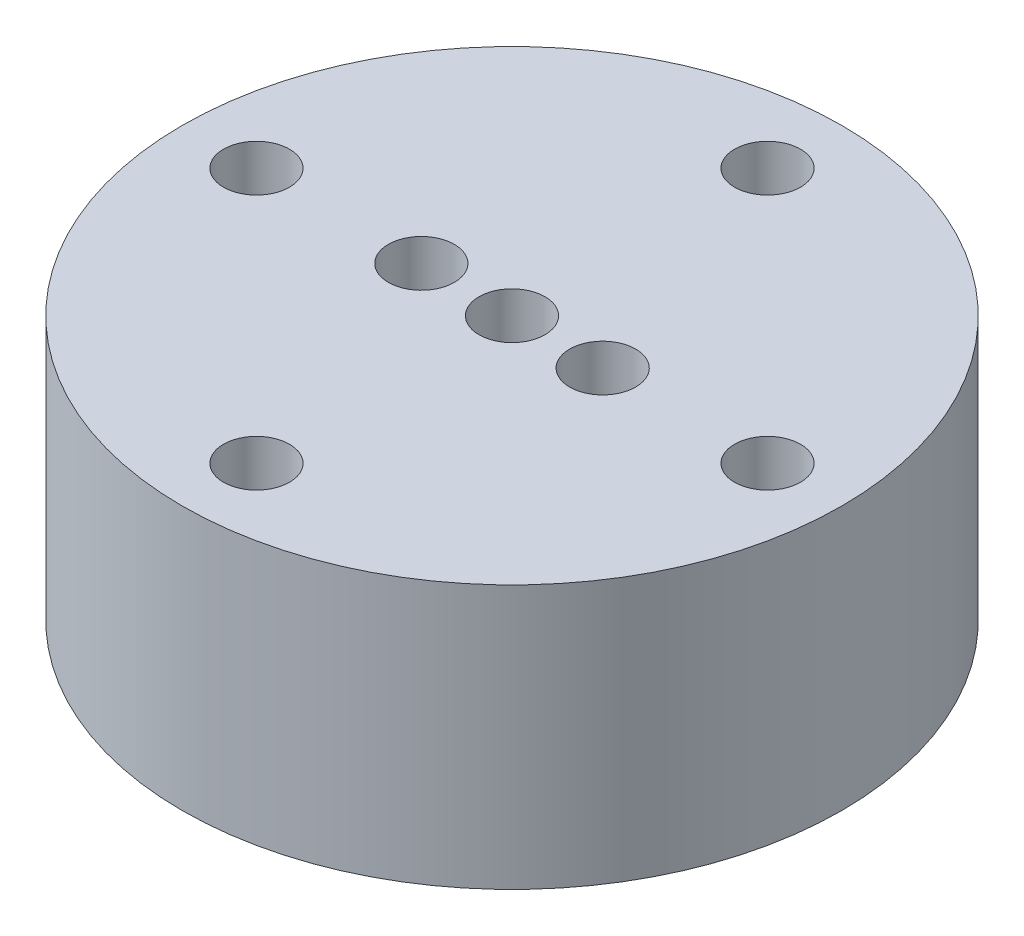
ISO-10303-21;
HEADER;
FILE_DESCRIPTION(('STEP AP214'),'2;1');
FILE_NAME('part.step','',(''),(''),'','','');
FILE_SCHEMA(('AUTOMOTIVE_DESIGN { 1 0 10303 214 1 1 1 1 }'));
ENDSEC;
DATA;
#1=APPLICATION_CONTEXT('core data for automotive mechanical design processes');
#2=APPLICATION_PROTOCOL_DEFINITION('international standard','automotive_design',2000,#1);
#3=PRODUCT_CONTEXT('',#1,'mechanical');
#4=PRODUCT('Part','Part','',(#3));
#5=PRODUCT_RELATED_PRODUCT_CATEGORY('part','',(#4));
#6=PRODUCT_DEFINITION_FORMATION('','',#4);
#7=PRODUCT_DEFINITION_CONTEXT('part definition',#1,'design');
#8=PRODUCT_DEFINITION('design','',#6,#7);
#9=PRODUCT_DEFINITION_SHAPE('','',#8);
#10=(LENGTH_UNIT() NAMED_UNIT(*) SI_UNIT(.MILLI.,.METRE.));
#11=(NAMED_UNIT(*) PLANE_ANGLE_UNIT() SI_UNIT($,.RADIAN.));
#12=(NAMED_UNIT(*) SI_UNIT($,.STERADIAN.) SOLID_ANGLE_UNIT());
#13=UNCERTAINTY_MEASURE_WITH_UNIT(LENGTH_MEASURE(1.E-05),#10,'distance_accuracy_value','');
#14=(GEOMETRIC_REPRESENTATION_CONTEXT(3) GLOBAL_UNCERTAINTY_ASSIGNED_CONTEXT((#13)) GLOBAL_UNIT_ASSIGNED_CONTEXT((#10,
#11,#12)) REPRESENTATION_CONTEXT('',''));
#15=CARTESIAN_POINT('',(0.,0.,0.));
#16=DIRECTION('',(0.,0.,1.));
#17=DIRECTION('',(1.,0.,0.));
#18=AXIS2_PLACEMENT_3D('',#15,#16,#17);
#19=CARTESIAN_POINT('',(0.,16.,0.));
#20=DIRECTION('',(0.,1.,0.));
#21=DIRECTION('',(0.,0.,1.));
#22=AXIS2_PLACEMENT_3D('',#19,#20,#21);
#23=PLANE('',#22);
#24=CARTESIAN_POINT('',(-5.5,16.,0.));
#25=DIRECTION('',(0.,1.,0.));
#26=DIRECTION('',(0.,0.,1.));
#27=AXIS2_PLACEMENT_3D('',#24,#25,#26);
#28=CIRCLE('',#27,2.);
#29=CARTESIAN_POINT('',(-5.5,16.,2.));
#30=VERTEX_POINT('',#29);
#31=EDGE_CURVE('E74',#30,#30,#28,.T.);
#32=ORIENTED_EDGE('',*,*,#31,.F.);
#33=EDGE_LOOP('',(#32));
#34=FACE_BOUND('',#33,.T.);
#35=CARTESIAN_POINT('',(5.5,16.,0.));
#36=DIRECTION('',(0.,1.,0.));
#37=DIRECTION('',(0.,0.,1.));
#38=AXIS2_PLACEMENT_3D('',#35,#36,#37);
#39=CIRCLE('',#38,2.);
#40=CARTESIAN_POINT('',(5.5,16.,2.));
#41=VERTEX_POINT('',#40);
#42=EDGE_CURVE('E80',#41,#41,#39,.T.);
#43=ORIENTED_EDGE('',*,*,#42,.F.);
#44=EDGE_LOOP('',(#43));
#45=FACE_BOUND('',#44,.T.);
#46=CARTESIAN_POINT('',(0.,16.,0.));
#47=DIRECTION('',(0.,1.,0.));
#48=DIRECTION('',(0.,0.,1.));
#49=AXIS2_PLACEMENT_3D('',#46,#47,#48);
#50=CIRCLE('',#49,2.);
#51=CARTESIAN_POINT('',(0.,16.,2.));
#52=VERTEX_POINT('',#51);
#53=EDGE_CURVE('E68',#52,#52,#50,.T.);
#54=ORIENTED_EDGE('',*,*,#53,.F.);
#55=EDGE_LOOP('',(#54));
#56=FACE_BOUND('',#55,.T.);
#57=CARTESIAN_POINT('',(8.75378384726489E-13,16.,15.5));
#58=DIRECTION('',(0.,1.,0.));
#59=DIRECTION('',(0.,0.,1.));
#60=AXIS2_PLACEMENT_3D('',#57,#58,#59);
#61=CIRCLE('',#60,2.);
#62=CARTESIAN_POINT('',(8.75378384726489E-13,16.,17.5));
#63=VERTEX_POINT('',#62);
#64=EDGE_CURVE('E53',#63,#63,#61,.T.);
#65=ORIENTED_EDGE('',*,*,#64,.F.);
#66=EDGE_LOOP('',(#65));
#67=FACE_BOUND('',#66,.T.);
#68=CARTESIAN_POINT('',(0.,16.,-15.5));
#69=DIRECTION('',(0.,1.,0.));
#70=DIRECTION('',(0.,0.,1.));
#71=AXIS2_PLACEMENT_3D('',#68,#69,#70);
#72=CIRCLE('',#71,2.);
#73=CARTESIAN_POINT('',(0.,16.,-13.5));
#74=VERTEX_POINT('',#73);
#75=EDGE_CURVE('E42',#74,#74,#72,.T.);
#76=ORIENTED_EDGE('',*,*,#75,.F.);
#77=EDGE_LOOP('',(#76));
#78=FACE_BOUND('',#77,.T.);
#79=CARTESIAN_POINT('',(0.,16.,0.));
#80=DIRECTION('',(0.,1.,0.));
#81=DIRECTION('',(0.,0.,1.));
#82=AXIS2_PLACEMENT_3D('',#79,#80,#81);
#83=CIRCLE('',#82,20.);
#84=CARTESIAN_POINT('',(0.,16.,20.));
#85=VERTEX_POINT('',#84);
#86=EDGE_CURVE('E10',#85,#85,#83,.T.);
#87=ORIENTED_EDGE('',*,*,#86,.T.);
#88=EDGE_LOOP('',(#87));
#89=FACE_BOUND('',#88,.T.);
#90=CARTESIAN_POINT('',(15.5000000000004,16.,-4.37689192363245E-13));
#91=DIRECTION('',(0.,1.,0.));
#92=DIRECTION('',(0.,0.,1.));
#93=AXIS2_PLACEMENT_3D('',#90,#91,#92);
#94=CIRCLE('',#93,2.);
#95=CARTESIAN_POINT('',(15.5000000000004,16.,1.99999999999957));
#96=VERTEX_POINT('',#95);
#97=EDGE_CURVE('E47',#96,#96,#94,.T.);
#98=ORIENTED_EDGE('',*,*,#97,.F.);
#99=EDGE_LOOP('',(#98));
#100=FACE_BOUND('',#99,.T.);
#101=CARTESIAN_POINT('',(-15.4999999999996,16.,4.39587394901923E-13));
#102=DIRECTION('',(0.,1.,0.));
#103=DIRECTION('',(0.,0.,1.));
#104=AXIS2_PLACEMENT_3D('',#101,#102,#103);
#105=CIRCLE('',#104,2.);
#106=CARTESIAN_POINT('',(-15.4999999999996,16.,2.00000000000044));
#107=VERTEX_POINT('',#106);
#108=EDGE_CURVE('E59',#107,#107,#105,.T.);
#109=ORIENTED_EDGE('',*,*,#108,.F.);
#110=EDGE_LOOP('',(#109));
#111=FACE_BOUND('',#110,.T.);
#112=ADVANCED_FACE('F31',(#34,#45,#56,#67,#78,#89,#100,#111),#23,.T.);
#113=CARTESIAN_POINT('',(0.,0.,0.));
#114=DIRECTION('',(0.,1.,0.));
#115=DIRECTION('',(0.,0.,1.));
#116=AXIS2_PLACEMENT_3D('',#113,#114,#115);
#117=PLANE('',#116);
#118=CARTESIAN_POINT('',(-5.5,0.,0.));
#119=DIRECTION('',(0.,1.,0.));
#120=DIRECTION('',(0.,0.,1.));
#121=AXIS2_PLACEMENT_3D('',#118,#119,#120);
#122=CIRCLE('',#121,2.);
#123=CARTESIAN_POINT('',(-5.5,0.,2.));
#124=VERTEX_POINT('',#123);
#125=EDGE_CURVE('E77',#124,#124,#122,.T.);
#126=ORIENTED_EDGE('',*,*,#125,.T.);
#127=EDGE_LOOP('',(#126));
#128=FACE_BOUND('',#127,.T.);
#129=CARTESIAN_POINT('',(5.5,0.,0.));
#130=DIRECTION('',(0.,1.,0.));
#131=DIRECTION('',(0.,0.,1.));
#132=AXIS2_PLACEMENT_3D('',#129,#130,#131);
#133=CIRCLE('',#132,2.);
#134=CARTESIAN_POINT('',(5.5,0.,2.));
#135=VERTEX_POINT('',#134);
#136=EDGE_CURVE('E71',#135,#135,#133,.T.);
#137=ORIENTED_EDGE('',*,*,#136,.T.);
#138=EDGE_LOOP('',(#137));
#139=FACE_BOUND('',#138,.T.);
#140=CARTESIAN_POINT('',(0.,0.,0.));
#141=DIRECTION('',(0.,1.,0.));
#142=DIRECTION('',(0.,0.,1.));
#143=AXIS2_PLACEMENT_3D('',#140,#141,#142);
#144=CIRCLE('',#143,2.);
#145=CARTESIAN_POINT('',(0.,0.,2.));
#146=VERTEX_POINT('',#145);
#147=EDGE_CURVE('E65',#146,#146,#144,.T.);
#148=ORIENTED_EDGE('',*,*,#147,.T.);
#149=EDGE_LOOP('',(#148));
#150=FACE_BOUND('',#149,.T.);
#151=CARTESIAN_POINT('',(0.,0.,0.));
#152=DIRECTION('',(0.,1.,0.));
#153=DIRECTION('',(0.,0.,1.));
#154=AXIS2_PLACEMENT_3D('',#151,#152,#153);
#155=CIRCLE('',#154,20.);
#156=CARTESIAN_POINT('',(0.,0.,20.));
#157=VERTEX_POINT('',#156);
#158=EDGE_CURVE('E35',#157,#157,#155,.T.);
#159=ORIENTED_EDGE('',*,*,#158,.F.);
#160=EDGE_LOOP('',(#159));
#161=FACE_BOUND('',#160,.T.);
#162=CARTESIAN_POINT('',(0.,0.,-15.5));
#163=DIRECTION('',(0.,1.,0.));
#164=DIRECTION('',(0.,0.,1.));
#165=AXIS2_PLACEMENT_3D('',#162,#163,#164);
#166=CIRCLE('',#165,2.);
#167=CARTESIAN_POINT('',(0.,0.,-13.5));
#168=VERTEX_POINT('',#167);
#169=EDGE_CURVE('E44',#168,#168,#166,.T.);
#170=ORIENTED_EDGE('',*,*,#169,.T.);
#171=EDGE_LOOP('',(#170));
#172=FACE_BOUND('',#171,.T.);
#173=CARTESIAN_POINT('',(15.5000000000004,0.,-4.37689192363245E-13));
#174=DIRECTION('',(0.,1.,0.));
#175=DIRECTION('',(0.,0.,1.));
#176=AXIS2_PLACEMENT_3D('',#173,#174,#175);
#177=CIRCLE('',#176,2.);
#178=CARTESIAN_POINT('',(15.5000000000004,0.,1.99999999999957));
#179=VERTEX_POINT('',#178);
#180=EDGE_CURVE('E50',#179,#179,#177,.T.);
#181=ORIENTED_EDGE('',*,*,#180,.T.);
#182=EDGE_LOOP('',(#181));
#183=FACE_BOUND('',#182,.T.);
#184=CARTESIAN_POINT('',(8.75378384726489E-13,0.,15.5));
#185=DIRECTION('',(0.,1.,0.));
#186=DIRECTION('',(0.,0.,1.));
#187=AXIS2_PLACEMENT_3D('',#184,#185,#186);
#188=CIRCLE('',#187,2.);
#189=CARTESIAN_POINT('',(8.75378384726489E-13,0.,17.5));
#190=VERTEX_POINT('',#189);
#191=EDGE_CURVE('E56',#190,#190,#188,.T.);
#192=ORIENTED_EDGE('',*,*,#191,.T.);
#193=EDGE_LOOP('',(#192));
#194=FACE_BOUND('',#193,.T.);
#195=CARTESIAN_POINT('',(-15.4999999999996,0.,4.39587394901923E-13));
#196=DIRECTION('',(0.,1.,0.));
#197=DIRECTION('',(0.,0.,1.));
#198=AXIS2_PLACEMENT_3D('',#195,#196,#197);
#199=CIRCLE('',#198,2.);
#200=CARTESIAN_POINT('',(-15.4999999999996,0.,2.00000000000044));
#201=VERTEX_POINT('',#200);
#202=EDGE_CURVE('E62',#201,#201,#199,.T.);
#203=ORIENTED_EDGE('',*,*,#202,.T.);
#204=EDGE_LOOP('',(#203));
#205=FACE_BOUND('',#204,.T.);
#206=ADVANCED_FACE('F86',(#128,#139,#150,#161,#172,#183,#194,#205),#117,.F.);
#207=CARTESIAN_POINT('',(0.,16.,0.));
#208=DIRECTION('',(0.,-1.,0.));
#209=DIRECTION('',(0.,0.,-1.));
#210=AXIS2_PLACEMENT_3D('',#207,#208,#209);
#211=CYLINDRICAL_SURFACE('',#210,20.);
#212=ORIENTED_EDGE('',*,*,#86,.F.);
#213=EDGE_LOOP('',(#212));
#214=FACE_BOUND('',#213,.T.);
#215=ORIENTED_EDGE('',*,*,#158,.T.);
#216=EDGE_LOOP('',(#215));
#217=FACE_BOUND('',#216,.T.);
#218=ADVANCED_FACE('F33',(#214,#217),#211,.T.);
#219=CARTESIAN_POINT('',(0.,16.,-15.5));
#220=DIRECTION('',(0.,-1.,0.));
#221=DIRECTION('',(0.,0.,-1.));
#222=AXIS2_PLACEMENT_3D('',#219,#220,#221);
#223=CYLINDRICAL_SURFACE('',#222,2.);
#224=ORIENTED_EDGE('',*,*,#75,.T.);
#225=EDGE_LOOP('',(#224));
#226=FACE_BOUND('',#225,.T.);
#227=ORIENTED_EDGE('',*,*,#169,.F.);
#228=EDGE_LOOP('',(#227));
#229=FACE_BOUND('',#228,.T.);
#230=ADVANCED_FACE('F123',(#226,#229),#223,.F.);
#231=CARTESIAN_POINT('',(15.5000000000004,16.,-4.37689192363245E-13));
#232=DIRECTION('',(0.,-1.,0.));
#233=DIRECTION('',(0.,0.,-1.));
#234=AXIS2_PLACEMENT_3D('',#231,#232,#233);
#235=CYLINDRICAL_SURFACE('',#234,2.);
#236=ORIENTED_EDGE('',*,*,#97,.T.);
#237=EDGE_LOOP('',(#236));
#238=FACE_BOUND('',#237,.T.);
#239=ORIENTED_EDGE('',*,*,#180,.F.);
#240=EDGE_LOOP('',(#239));
#241=FACE_BOUND('',#240,.T.);
#242=ADVANCED_FACE('F128',(#238,#241),#235,.F.);
#243=CARTESIAN_POINT('',(8.75378384726489E-13,16.,15.5));
#244=DIRECTION('',(0.,-1.,0.));
#245=DIRECTION('',(0.,0.,-1.));
#246=AXIS2_PLACEMENT_3D('',#243,#244,#245);
#247=CYLINDRICAL_SURFACE('',#246,2.);
#248=ORIENTED_EDGE('',*,*,#64,.T.);
#249=EDGE_LOOP('',(#248));
#250=FACE_BOUND('',#249,.T.);
#251=ORIENTED_EDGE('',*,*,#191,.F.);
#252=EDGE_LOOP('',(#251));
#253=FACE_BOUND('',#252,.T.);
#254=ADVANCED_FACE('F114',(#250,#253),#247,.F.);
#255=CARTESIAN_POINT('',(-15.4999999999996,16.,4.39587394901923E-13));
#256=DIRECTION('',(0.,-1.,0.));
#257=DIRECTION('',(0.,0.,-1.));
#258=AXIS2_PLACEMENT_3D('',#255,#256,#257);
#259=CYLINDRICAL_SURFACE('',#258,2.);
#260=ORIENTED_EDGE('',*,*,#108,.T.);
#261=EDGE_LOOP('',(#260));
#262=FACE_BOUND('',#261,.T.);
#263=ORIENTED_EDGE('',*,*,#202,.F.);
#264=EDGE_LOOP('',(#263));
#265=FACE_BOUND('',#264,.T.);
#266=ADVANCED_FACE('F111',(#262,#265),#259,.F.);
#267=CARTESIAN_POINT('',(0.,0.,0.));
#268=DIRECTION('',(0.,1.,0.));
#269=DIRECTION('',(0.,0.,1.));
#270=AXIS2_PLACEMENT_3D('',#267,#268,#269);
#271=CYLINDRICAL_SURFACE('',#270,2.);
#272=ORIENTED_EDGE('',*,*,#147,.F.);
#273=EDGE_LOOP('',(#272));
#274=FACE_BOUND('',#273,.T.);
#275=ORIENTED_EDGE('',*,*,#53,.T.);
#276=EDGE_LOOP('',(#275));
#277=FACE_BOUND('',#276,.T.);
#278=ADVANCED_FACE('F93',(#274,#277),#271,.F.);
#279=CARTESIAN_POINT('',(5.5,0.,0.));
#280=DIRECTION('',(0.,1.,0.));
#281=DIRECTION('',(0.,0.,1.));
#282=AXIS2_PLACEMENT_3D('',#279,#280,#281);
#283=CYLINDRICAL_SURFACE('',#282,2.);
#284=ORIENTED_EDGE('',*,*,#136,.F.);
#285=EDGE_LOOP('',(#284));
#286=FACE_BOUND('',#285,.T.);
#287=ORIENTED_EDGE('',*,*,#42,.T.);
#288=EDGE_LOOP('',(#287));
#289=FACE_BOUND('',#288,.T.);
#290=ADVANCED_FACE('F89',(#286,#289),#283,.F.);
#291=CARTESIAN_POINT('',(-5.5,0.,0.));
#292=DIRECTION('',(0.,1.,0.));
#293=DIRECTION('',(0.,0.,1.));
#294=AXIS2_PLACEMENT_3D('',#291,#292,#293);
#295=CYLINDRICAL_SURFACE('',#294,2.);
#296=ORIENTED_EDGE('',*,*,#125,.F.);
#297=EDGE_LOOP('',(#296));
#298=FACE_BOUND('',#297,.T.);
#299=ORIENTED_EDGE('',*,*,#31,.T.);
#300=EDGE_LOOP('',(#299));
#301=FACE_BOUND('',#300,.T.);
#302=ADVANCED_FACE('F92',(#298,#301),#295,.F.);
#303=CLOSED_SHELL('',(#112,#206,#218,#230,#242,#254,#266,#278,#290,#302));
#304=MANIFOLD_SOLID_BREP('B2',#303);
#305=ADVANCED_BREP_SHAPE_REPRESENTATION('',(#18,#304),#14);
#306=SHAPE_DEFINITION_REPRESENTATION(#9,#305);
ENDSEC;
END-ISO-10303-21;
